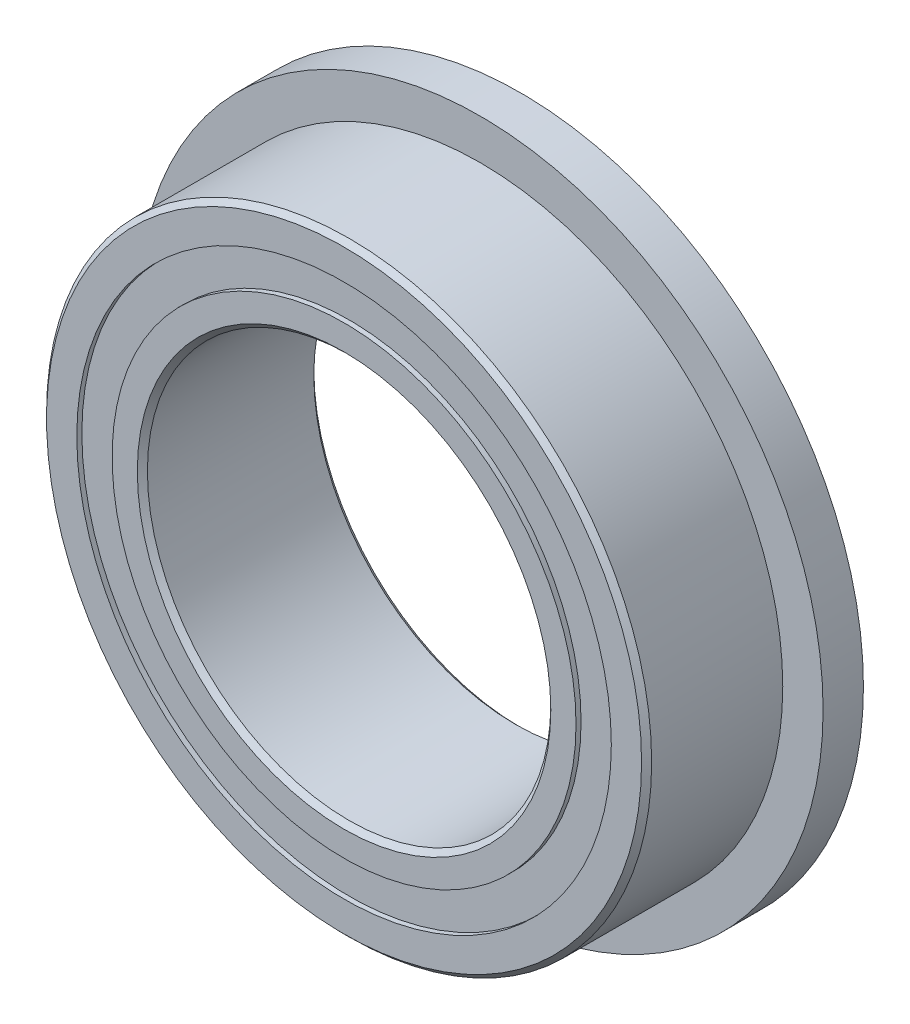
ISO-10303-21;
HEADER;
FILE_DESCRIPTION(('STEP AP214'),'2;1');
FILE_NAME('part.step','',(''),(''),'','','');
FILE_SCHEMA(('AUTOMOTIVE_DESIGN { 1 0 10303 214 1 1 1 1 }'));
ENDSEC;
DATA;
#1=APPLICATION_CONTEXT('core data for automotive mechanical design processes');
#2=APPLICATION_PROTOCOL_DEFINITION('international standard','automotive_design',2000,#1);
#3=PRODUCT_CONTEXT('',#1,'mechanical');
#4=PRODUCT('Part','Part','',(#3));
#5=PRODUCT_RELATED_PRODUCT_CATEGORY('part','',(#4));
#6=PRODUCT_DEFINITION_FORMATION('','',#4);
#7=PRODUCT_DEFINITION_CONTEXT('part definition',#1,'design');
#8=PRODUCT_DEFINITION('design','',#6,#7);
#9=PRODUCT_DEFINITION_SHAPE('','',#8);
#10=(LENGTH_UNIT() NAMED_UNIT(*) SI_UNIT(.MILLI.,.METRE.));
#11=(NAMED_UNIT(*) PLANE_ANGLE_UNIT() SI_UNIT($,.RADIAN.));
#12=(NAMED_UNIT(*) SI_UNIT($,.STERADIAN.) SOLID_ANGLE_UNIT());
#13=UNCERTAINTY_MEASURE_WITH_UNIT(LENGTH_MEASURE(1.E-05),#10,'distance_accuracy_value','');
#14=(GEOMETRIC_REPRESENTATION_CONTEXT(3) GLOBAL_UNCERTAINTY_ASSIGNED_CONTEXT((#13)) GLOBAL_UNIT_ASSIGNED_CONTEXT((#10,
#11,#12)) REPRESENTATION_CONTEXT('',''));
#15=CARTESIAN_POINT('',(0.,0.,0.));
#16=DIRECTION('',(0.,0.,1.));
#17=DIRECTION('',(1.,0.,0.));
#18=AXIS2_PLACEMENT_3D('',#15,#16,#17);
#19=CARTESIAN_POINT('',(0.,0.,-1.75000000001546));
#20=DIRECTION('',(0.,0.,1.));
#21=DIRECTION('',(1.,0.,0.));
#22=AXIS2_PLACEMENT_3D('',#19,#20,#21);
#23=CYLINDRICAL_SURFACE('',#22,4.);
#24=CARTESIAN_POINT('',(0.,0.,1.65));
#25=DIRECTION('',(0.,0.,1.));
#26=DIRECTION('',(1.,0.,0.));
#27=AXIS2_PLACEMENT_3D('',#24,#25,#26);
#28=CIRCLE('',#27,4.);
#29=CARTESIAN_POINT('',(4.,0.,1.65));
#30=VERTEX_POINT('',#29);
#31=EDGE_CURVE('E10',#30,#30,#28,.T.);
#32=ORIENTED_EDGE('',*,*,#31,.T.);
#33=EDGE_LOOP('',(#32));
#34=FACE_BOUND('',#33,.T.);
#35=CARTESIAN_POINT('',(0.,0.,-1.64999999998372));
#36=DIRECTION('',(0.,0.,1.));
#37=DIRECTION('',(1.,0.,0.));
#38=AXIS2_PLACEMENT_3D('',#35,#36,#37);
#39=CIRCLE('',#38,4.);
#40=CARTESIAN_POINT('',(4.,0.,-1.64999999998372));
#41=VERTEX_POINT('',#40);
#42=EDGE_CURVE('E86',#41,#41,#39,.T.);
#43=ORIENTED_EDGE('',*,*,#42,.F.);
#44=EDGE_LOOP('',(#43));
#45=FACE_BOUND('',#44,.T.);
#46=ADVANCED_FACE('F31',(#34,#45),#23,.F.);
#47=CARTESIAN_POINT('',(0.,0.,1.65));
#48=DIRECTION('',(0.,0.,1.));
#49=DIRECTION('',(1.,0.,0.));
#50=AXIS2_PLACEMENT_3D('',#47,#48,#49);
#51=CONICAL_SURFACE('',#50,4.,0.78539816339745);
#52=CARTESIAN_POINT('',(0.,0.,1.74999999997631));
#53=DIRECTION('',(0.,0.,1.));
#54=DIRECTION('',(1.,0.,0.));
#55=AXIS2_PLACEMENT_3D('',#52,#53,#54);
#56=CIRCLE('',#55,4.09999999997631);
#57=CARTESIAN_POINT('',(4.09999999997631,0.,1.74999999997631));
#58=VERTEX_POINT('',#57);
#59=EDGE_CURVE('E37',#58,#58,#56,.T.);
#60=ORIENTED_EDGE('',*,*,#59,.T.);
#61=EDGE_LOOP('',(#60));
#62=FACE_BOUND('',#61,.T.);
#63=ORIENTED_EDGE('',*,*,#31,.F.);
#64=EDGE_LOOP('',(#63));
#65=FACE_BOUND('',#64,.T.);
#66=ADVANCED_FACE('F94',(#62,#65),#51,.F.);
#67=CARTESIAN_POINT('',(4.09999999997631,0.,1.74999999997631));
#68=DIRECTION('',(0.,0.,1.));
#69=DIRECTION('',(1.,0.,0.));
#70=AXIS2_PLACEMENT_3D('',#67,#68,#69);
#71=PLANE('',#70);
#72=CARTESIAN_POINT('',(0.,0.,1.74999999997631));
#73=DIRECTION('',(0.,0.,1.));
#74=DIRECTION('',(1.,0.,0.));
#75=AXIS2_PLACEMENT_3D('',#72,#73,#74);
#76=CIRCLE('',#75,4.59999999998231);
#77=CARTESIAN_POINT('',(4.59999999998231,0.,1.74999999997631));
#78=VERTEX_POINT('',#77);
#79=EDGE_CURVE('E41',#78,#78,#76,.T.);
#80=ORIENTED_EDGE('',*,*,#79,.T.);
#81=EDGE_LOOP('',(#80));
#82=FACE_BOUND('',#81,.T.);
#83=ORIENTED_EDGE('',*,*,#59,.F.);
#84=EDGE_LOOP('',(#83));
#85=FACE_BOUND('',#84,.T.);
#86=ADVANCED_FACE('F98',(#82,#85),#71,.T.);
#87=CARTESIAN_POINT('',(0.,0.,-1.75000000001546));
#88=DIRECTION('',(0.,0.,1.));
#89=DIRECTION('',(1.,0.,0.));
#90=AXIS2_PLACEMENT_3D('',#87,#88,#89);
#91=CYLINDRICAL_SURFACE('',#90,4.59999999998231);
#92=CARTESIAN_POINT('',(0.,0.,1.64999999997631));
#93=DIRECTION('',(0.,0.,1.));
#94=DIRECTION('',(1.,0.,0.));
#95=AXIS2_PLACEMENT_3D('',#92,#93,#94);
#96=CIRCLE('',#95,4.59999999998231);
#97=CARTESIAN_POINT('',(4.59999999998231,0.,1.64999999997631));
#98=VERTEX_POINT('',#97);
#99=EDGE_CURVE('E45',#98,#98,#96,.T.);
#100=ORIENTED_EDGE('',*,*,#99,.T.);
#101=EDGE_LOOP('',(#100));
#102=FACE_BOUND('',#101,.T.);
#103=ORIENTED_EDGE('',*,*,#79,.F.);
#104=EDGE_LOOP('',(#103));
#105=FACE_BOUND('',#104,.T.);
#106=ADVANCED_FACE('F102',(#102,#105),#91,.T.);
#107=CARTESIAN_POINT('',(4.59999999998231,0.,1.64999999997631));
#108=DIRECTION('',(0.,0.,1.));
#109=DIRECTION('',(1.,0.,0.));
#110=AXIS2_PLACEMENT_3D('',#107,#108,#109);
#111=PLANE('',#110);
#112=CARTESIAN_POINT('',(0.,0.,1.64999999997631));
#113=DIRECTION('',(0.,0.,1.));
#114=DIRECTION('',(1.,0.,0.));
#115=AXIS2_PLACEMENT_3D('',#112,#113,#114);
#116=CIRCLE('',#115,5.29999999998231);
#117=CARTESIAN_POINT('',(5.29999999998231,0.,1.64999999997631));
#118=VERTEX_POINT('',#117);
#119=EDGE_CURVE('E50',#118,#118,#116,.T.);
#120=ORIENTED_EDGE('',*,*,#119,.T.);
#121=EDGE_LOOP('',(#120));
#122=FACE_BOUND('',#121,.T.);
#123=ORIENTED_EDGE('',*,*,#99,.F.);
#124=EDGE_LOOP('',(#123));
#125=FACE_BOUND('',#124,.T.);
#126=ADVANCED_FACE('F109',(#122,#125),#111,.T.);
#127=CARTESIAN_POINT('',(0.,0.,-1.75000000001546));
#128=DIRECTION('',(0.,0.,1.));
#129=DIRECTION('',(1.,0.,0.));
#130=AXIS2_PLACEMENT_3D('',#127,#128,#129);
#131=CYLINDRICAL_SURFACE('',#130,5.29999999998231);
#132=CARTESIAN_POINT('',(0.,0.,1.74999999997631));
#133=DIRECTION('',(0.,0.,1.));
#134=DIRECTION('',(1.,0.,0.));
#135=AXIS2_PLACEMENT_3D('',#132,#133,#134);
#136=CIRCLE('',#135,5.29999999998231);
#137=CARTESIAN_POINT('',(5.29999999998231,0.,1.74999999997631));
#138=VERTEX_POINT('',#137);
#139=EDGE_CURVE('E53',#138,#138,#136,.T.);
#140=ORIENTED_EDGE('',*,*,#139,.T.);
#141=EDGE_LOOP('',(#140));
#142=FACE_BOUND('',#141,.T.);
#143=ORIENTED_EDGE('',*,*,#119,.F.);
#144=EDGE_LOOP('',(#143));
#145=FACE_BOUND('',#144,.T.);
#146=ADVANCED_FACE('F113',(#142,#145),#131,.F.);
#147=CARTESIAN_POINT('',(5.29999999998231,0.,1.74999999997631));
#148=DIRECTION('',(0.,0.,1.));
#149=DIRECTION('',(1.,0.,0.));
#150=AXIS2_PLACEMENT_3D('',#147,#148,#149);
#151=PLANE('',#150);
#152=CARTESIAN_POINT('',(0.,0.,1.74999999997631));
#153=DIRECTION('',(0.,0.,1.));
#154=DIRECTION('',(1.,0.,0.));
#155=AXIS2_PLACEMENT_3D('',#152,#153,#154);
#156=CIRCLE('',#155,5.89999999997922);
#157=CARTESIAN_POINT('',(5.89999999997922,0.,1.74999999997631));
#158=VERTEX_POINT('',#157);
#159=EDGE_CURVE('E56',#158,#158,#156,.T.);
#160=ORIENTED_EDGE('',*,*,#159,.T.);
#161=EDGE_LOOP('',(#160));
#162=FACE_BOUND('',#161,.T.);
#163=ORIENTED_EDGE('',*,*,#139,.F.);
#164=EDGE_LOOP('',(#163));
#165=FACE_BOUND('',#164,.T.);
#166=ADVANCED_FACE('F117',(#162,#165),#151,.T.);
#167=CARTESIAN_POINT('',(0.,0.,1.74999999997631));
#168=DIRECTION('',(0.,0.,-1.));
#169=DIRECTION('',(-1.,0.,0.));
#170=AXIS2_PLACEMENT_3D('',#167,#168,#169);
#171=CONICAL_SURFACE('',#170,5.89999999997922,0.785398163397446);
#172=CARTESIAN_POINT('',(0.,0.,1.64999999999545));
#173=DIRECTION('',(0.,0.,1.));
#174=DIRECTION('',(1.,0.,0.));
#175=AXIS2_PLACEMENT_3D('',#172,#173,#174);
#176=CIRCLE('',#175,5.99999999996007);
#177=CARTESIAN_POINT('',(5.99999999996007,0.,1.64999999999545));
#178=VERTEX_POINT('',#177);
#179=EDGE_CURVE('E59',#178,#178,#176,.T.);
#180=ORIENTED_EDGE('',*,*,#179,.T.);
#181=EDGE_LOOP('',(#180));
#182=FACE_BOUND('',#181,.T.);
#183=ORIENTED_EDGE('',*,*,#159,.F.);
#184=EDGE_LOOP('',(#183));
#185=FACE_BOUND('',#184,.T.);
#186=ADVANCED_FACE('F121',(#182,#185),#171,.T.);
#187=CARTESIAN_POINT('',(0.,0.,-1.75000000001546));
#188=DIRECTION('',(0.,0.,1.));
#189=DIRECTION('',(1.,0.,0.));
#190=AXIS2_PLACEMENT_3D('',#187,#188,#189);
#191=CYLINDRICAL_SURFACE('',#190,5.99999999996007);
#192=CARTESIAN_POINT('',(0.,0.,-0.950000000004549));
#193=DIRECTION('',(0.,0.,1.));
#194=DIRECTION('',(1.,0.,0.));
#195=AXIS2_PLACEMENT_3D('',#192,#193,#194);
#196=CIRCLE('',#195,5.99999999996007);
#197=CARTESIAN_POINT('',(5.99999999996007,0.,-0.950000000004549));
#198=VERTEX_POINT('',#197);
#199=EDGE_CURVE('E62',#198,#198,#196,.T.);
#200=ORIENTED_EDGE('',*,*,#199,.T.);
#201=EDGE_LOOP('',(#200));
#202=FACE_BOUND('',#201,.T.);
#203=ORIENTED_EDGE('',*,*,#179,.F.);
#204=EDGE_LOOP('',(#203));
#205=FACE_BOUND('',#204,.T.);
#206=ADVANCED_FACE('F125',(#202,#205),#191,.T.);
#207=CARTESIAN_POINT('',(5.99999999996007,0.,-0.950000000004549));
#208=DIRECTION('',(0.,0.,1.));
#209=DIRECTION('',(1.,0.,0.));
#210=AXIS2_PLACEMENT_3D('',#207,#208,#209);
#211=PLANE('',#210);
#212=CARTESIAN_POINT('',(0.,0.,-0.950000000004549));
#213=DIRECTION('',(0.,0.,1.));
#214=DIRECTION('',(1.,0.,0.));
#215=AXIS2_PLACEMENT_3D('',#212,#213,#214);
#216=CIRCLE('',#215,6.79999999996007);
#217=CARTESIAN_POINT('',(6.79999999996007,0.,-0.950000000004549));
#218=VERTEX_POINT('',#217);
#219=EDGE_CURVE('E65',#218,#218,#216,.T.);
#220=ORIENTED_EDGE('',*,*,#219,.T.);
#221=EDGE_LOOP('',(#220));
#222=FACE_BOUND('',#221,.T.);
#223=ORIENTED_EDGE('',*,*,#199,.F.);
#224=EDGE_LOOP('',(#223));
#225=FACE_BOUND('',#224,.T.);
#226=ADVANCED_FACE('F129',(#222,#225),#211,.T.);
#227=CARTESIAN_POINT('',(0.,0.,-1.75000000001546));
#228=DIRECTION('',(0.,0.,1.));
#229=DIRECTION('',(1.,0.,0.));
#230=AXIS2_PLACEMENT_3D('',#227,#228,#229);
#231=CYLINDRICAL_SURFACE('',#230,6.79999999996007);
#232=CARTESIAN_POINT('',(0.,0.,-1.75000000001546));
#233=DIRECTION('',(0.,0.,1.));
#234=DIRECTION('',(1.,0.,0.));
#235=AXIS2_PLACEMENT_3D('',#232,#233,#234);
#236=CIRCLE('',#235,6.79999999996007);
#237=CARTESIAN_POINT('',(6.79999999996007,0.,-1.75000000001546));
#238=VERTEX_POINT('',#237);
#239=EDGE_CURVE('E68',#238,#238,#236,.T.);
#240=ORIENTED_EDGE('',*,*,#239,.T.);
#241=EDGE_LOOP('',(#240));
#242=FACE_BOUND('',#241,.T.);
#243=ORIENTED_EDGE('',*,*,#219,.F.);
#244=EDGE_LOOP('',(#243));
#245=FACE_BOUND('',#244,.T.);
#246=ADVANCED_FACE('F133',(#242,#245),#231,.T.);
#247=CARTESIAN_POINT('',(6.79999999996007,0.,-1.75000000001546));
#248=DIRECTION('',(0.,0.,-1.));
#249=DIRECTION('',(-1.,0.,0.));
#250=AXIS2_PLACEMENT_3D('',#247,#248,#249);
#251=PLANE('',#250);
#252=CARTESIAN_POINT('',(0.,0.,-1.75000000001546));
#253=DIRECTION('',(0.,0.,1.));
#254=DIRECTION('',(1.,0.,0.));
#255=AXIS2_PLACEMENT_3D('',#252,#253,#254);
#256=CIRCLE('',#255,5.29999999998231);
#257=CARTESIAN_POINT('',(5.29999999998231,0.,-1.75000000001546));
#258=VERTEX_POINT('',#257);
#259=EDGE_CURVE('E71',#258,#258,#256,.T.);
#260=ORIENTED_EDGE('',*,*,#259,.T.);
#261=EDGE_LOOP('',(#260));
#262=FACE_BOUND('',#261,.T.);
#263=ORIENTED_EDGE('',*,*,#239,.F.);
#264=EDGE_LOOP('',(#263));
#265=FACE_BOUND('',#264,.T.);
#266=ADVANCED_FACE('F137',(#262,#265),#251,.T.);
#267=CARTESIAN_POINT('',(0.,0.,-1.75000000001546));
#268=DIRECTION('',(0.,0.,1.));
#269=DIRECTION('',(1.,0.,0.));
#270=AXIS2_PLACEMENT_3D('',#267,#268,#269);
#271=CYLINDRICAL_SURFACE('',#270,5.29999999998231);
#272=CARTESIAN_POINT('',(0.,0.,-1.65000000002369));
#273=DIRECTION('',(0.,0.,1.));
#274=DIRECTION('',(1.,0.,0.));
#275=AXIS2_PLACEMENT_3D('',#272,#273,#274);
#276=CIRCLE('',#275,5.29999999998231);
#277=CARTESIAN_POINT('',(5.29999999998231,0.,-1.65000000002369));
#278=VERTEX_POINT('',#277);
#279=EDGE_CURVE('E74',#278,#278,#276,.T.);
#280=ORIENTED_EDGE('',*,*,#279,.T.);
#281=EDGE_LOOP('',(#280));
#282=FACE_BOUND('',#281,.T.);
#283=ORIENTED_EDGE('',*,*,#259,.F.);
#284=EDGE_LOOP('',(#283));
#285=FACE_BOUND('',#284,.T.);
#286=ADVANCED_FACE('F141',(#282,#285),#271,.F.);
#287=CARTESIAN_POINT('',(5.29999999998231,0.,-1.65000000002369));
#288=DIRECTION('',(0.,0.,-1.));
#289=DIRECTION('',(-1.,0.,0.));
#290=AXIS2_PLACEMENT_3D('',#287,#288,#289);
#291=PLANE('',#290);
#292=CARTESIAN_POINT('',(0.,0.,-1.65000000002369));
#293=DIRECTION('',(0.,0.,1.));
#294=DIRECTION('',(1.,0.,0.));
#295=AXIS2_PLACEMENT_3D('',#292,#293,#294);
#296=CIRCLE('',#295,4.59999999998231);
#297=CARTESIAN_POINT('',(4.59999999998231,0.,-1.65000000002369));
#298=VERTEX_POINT('',#297);
#299=EDGE_CURVE('E77',#298,#298,#296,.T.);
#300=ORIENTED_EDGE('',*,*,#299,.T.);
#301=EDGE_LOOP('',(#300));
#302=FACE_BOUND('',#301,.T.);
#303=ORIENTED_EDGE('',*,*,#279,.F.);
#304=EDGE_LOOP('',(#303));
#305=FACE_BOUND('',#304,.T.);
#306=ADVANCED_FACE('F145',(#302,#305),#291,.T.);
#307=CARTESIAN_POINT('',(0.,0.,-1.75000000001546));
#308=DIRECTION('',(0.,0.,1.));
#309=DIRECTION('',(1.,0.,0.));
#310=AXIS2_PLACEMENT_3D('',#307,#308,#309);
#311=CYLINDRICAL_SURFACE('',#310,4.59999999998231);
#312=CARTESIAN_POINT('',(0.,0.,-1.75000000001546));
#313=DIRECTION('',(0.,0.,1.));
#314=DIRECTION('',(1.,0.,0.));
#315=AXIS2_PLACEMENT_3D('',#312,#313,#314);
#316=CIRCLE('',#315,4.59999999998231);
#317=CARTESIAN_POINT('',(4.59999999998231,0.,-1.75000000001546));
#318=VERTEX_POINT('',#317);
#319=EDGE_CURVE('E80',#318,#318,#316,.T.);
#320=ORIENTED_EDGE('',*,*,#319,.T.);
#321=EDGE_LOOP('',(#320));
#322=FACE_BOUND('',#321,.T.);
#323=ORIENTED_EDGE('',*,*,#299,.F.);
#324=EDGE_LOOP('',(#323));
#325=FACE_BOUND('',#324,.T.);
#326=ADVANCED_FACE('F149',(#322,#325),#311,.T.);
#327=CARTESIAN_POINT('',(4.59999999998231,0.,-1.75000000001546));
#328=DIRECTION('',(0.,0.,-1.));
#329=DIRECTION('',(-1.,0.,0.));
#330=AXIS2_PLACEMENT_3D('',#327,#328,#329);
#331=PLANE('',#330);
#332=CARTESIAN_POINT('',(0.,0.,-1.75000000001546));
#333=DIRECTION('',(0.,0.,1.));
#334=DIRECTION('',(1.,0.,0.));
#335=AXIS2_PLACEMENT_3D('',#332,#333,#334);
#336=CIRCLE('',#335,4.10000000003174);
#337=CARTESIAN_POINT('',(4.10000000003174,0.,-1.75000000001546));
#338=VERTEX_POINT('',#337);
#339=EDGE_CURVE('E83',#338,#338,#336,.T.);
#340=ORIENTED_EDGE('',*,*,#339,.T.);
#341=EDGE_LOOP('',(#340));
#342=FACE_BOUND('',#341,.T.);
#343=ORIENTED_EDGE('',*,*,#319,.F.);
#344=EDGE_LOOP('',(#343));
#345=FACE_BOUND('',#344,.T.);
#346=ADVANCED_FACE('F153',(#342,#345),#331,.T.);
#347=CARTESIAN_POINT('',(0.,0.,-1.75000000001546));
#348=DIRECTION('',(0.,0.,-1.));
#349=DIRECTION('',(-1.,0.,0.));
#350=AXIS2_PLACEMENT_3D('',#347,#348,#349);
#351=CONICAL_SURFACE('',#350,4.10000000003174,0.785398163397448);
#352=ORIENTED_EDGE('',*,*,#42,.T.);
#353=EDGE_LOOP('',(#352));
#354=FACE_BOUND('',#353,.T.);
#355=ORIENTED_EDGE('',*,*,#339,.F.);
#356=EDGE_LOOP('',(#355));
#357=FACE_BOUND('',#356,.T.);
#358=ADVANCED_FACE('F90',(#354,#357),#351,.F.);
#359=CLOSED_SHELL('',(#46,#66,#86,#106,#126,#146,#166,#186,#206,#226,#246,#266,#286,#306,#326,
#346,#358));
#360=MANIFOLD_SOLID_BREP('B2',#359);
#361=ADVANCED_BREP_SHAPE_REPRESENTATION('',(#18,#360),#14);
#362=SHAPE_DEFINITION_REPRESENTATION(#9,#361);
ENDSEC;
END-ISO-10303-21;
